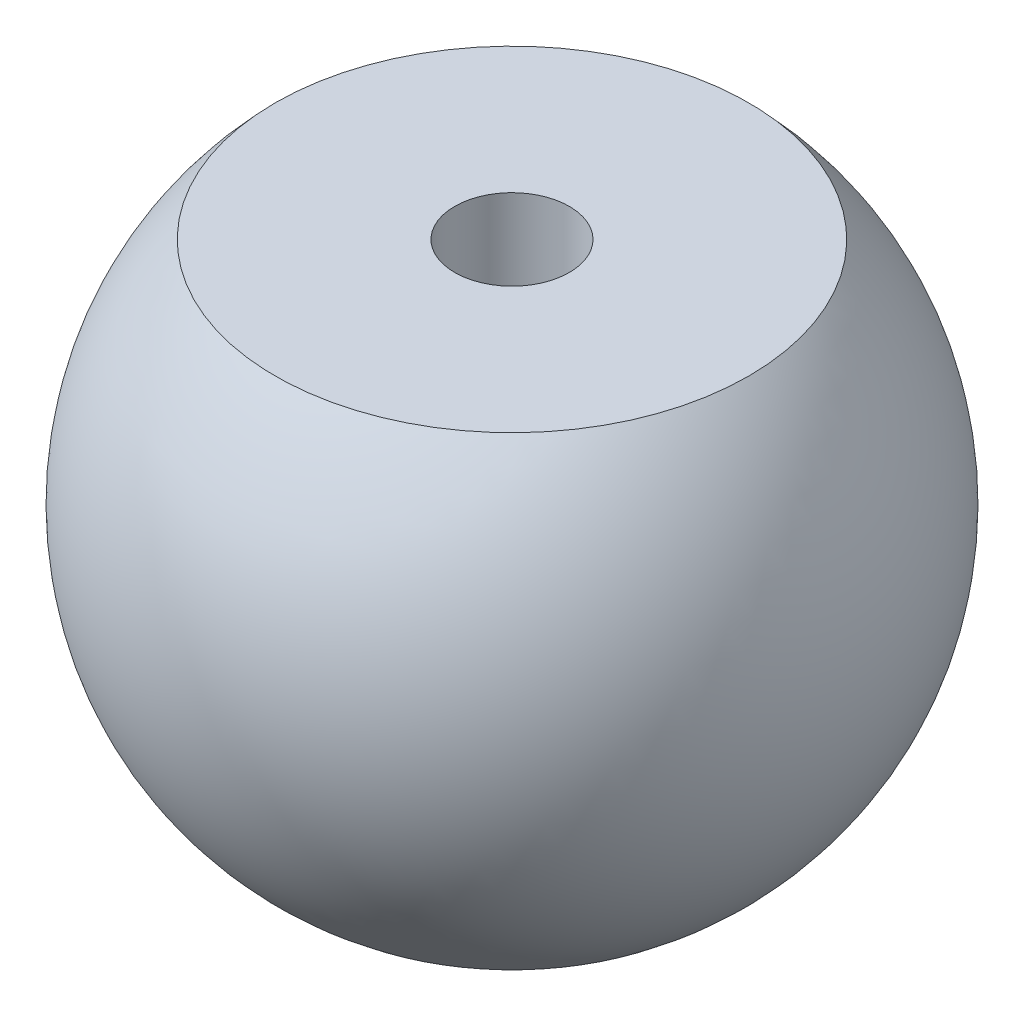
ISO-10303-21;
HEADER;
FILE_DESCRIPTION(('STEP AP214'),'2;1');
FILE_NAME('part.step','',(''),(''),'','','');
FILE_SCHEMA(('AUTOMOTIVE_DESIGN { 1 0 10303 214 1 1 1 1 }'));
ENDSEC;
DATA;
#1=APPLICATION_CONTEXT('core data for automotive mechanical design processes');
#2=APPLICATION_PROTOCOL_DEFINITION('international standard','automotive_design',2000,#1);
#3=PRODUCT_CONTEXT('',#1,'mechanical');
#4=PRODUCT('Part','Part','',(#3));
#5=PRODUCT_RELATED_PRODUCT_CATEGORY('part','',(#4));
#6=PRODUCT_DEFINITION_FORMATION('','',#4);
#7=PRODUCT_DEFINITION_CONTEXT('part definition',#1,'design');
#8=PRODUCT_DEFINITION('design','',#6,#7);
#9=PRODUCT_DEFINITION_SHAPE('','',#8);
#10=(LENGTH_UNIT() NAMED_UNIT(*) SI_UNIT(.MILLI.,.METRE.));
#11=(NAMED_UNIT(*) PLANE_ANGLE_UNIT() SI_UNIT($,.RADIAN.));
#12=(NAMED_UNIT(*) SI_UNIT($,.STERADIAN.) SOLID_ANGLE_UNIT());
#13=UNCERTAINTY_MEASURE_WITH_UNIT(LENGTH_MEASURE(1.E-05),#10,'distance_accuracy_value','');
#14=(GEOMETRIC_REPRESENTATION_CONTEXT(3) GLOBAL_UNCERTAINTY_ASSIGNED_CONTEXT((#13)) GLOBAL_UNIT_ASSIGNED_CONTEXT((#10,
#11,#12)) REPRESENTATION_CONTEXT('',''));
#15=CARTESIAN_POINT('',(0.,0.,0.));
#16=DIRECTION('',(0.,0.,1.));
#17=DIRECTION('',(1.,0.,0.));
#18=AXIS2_PLACEMENT_3D('',#15,#16,#17);
#19=CARTESIAN_POINT('',(0.,-11.,0.));
#20=DIRECTION('',(0.,1.,0.));
#21=DIRECTION('',(-1.,0.,0.));
#22=AXIS2_PLACEMENT_3D('',#19,#20,#21);
#23=PLANE('',#22);
#24=CARTESIAN_POINT('',(0.,-11.,0.));
#25=DIRECTION('',(0.,1.,0.));
#26=DIRECTION('',(-1.,0.,0.));
#27=AXIS2_PLACEMENT_3D('',#24,#25,#26);
#28=CIRCLE('',#27,3.35410196624968);
#29=CARTESIAN_POINT('',(3.35410196624969,-11.,0.));
#30=VERTEX_POINT('',#29);
#31=EDGE_CURVE('E10',#30,#30,#28,.T.);
#32=ORIENTED_EDGE('',*,*,#31,.F.);
#33=EDGE_LOOP('',(#32));
#34=FACE_BOUND('',#33,.T.);
#35=CARTESIAN_POINT('',(0.,-11.,0.));
#36=DIRECTION('',(0.,1.,0.));
#37=DIRECTION('',(-1.,0.,0.));
#38=AXIS2_PLACEMENT_3D('',#35,#36,#37);
#39=CIRCLE('',#38,2.);
#40=CARTESIAN_POINT('',(-1.99999999999999,-11.,0.));
#41=VERTEX_POINT('',#40);
#42=EDGE_CURVE('E48',#41,#41,#39,.T.);
#43=ORIENTED_EDGE('',*,*,#42,.T.);
#44=EDGE_LOOP('',(#43));
#45=FACE_BOUND('',#44,.T.);
#46=ADVANCED_FACE('F34',(#34,#45),#23,.F.);
#47=CARTESIAN_POINT('',(0.,0.,0.));
#48=DIRECTION('',(0.,1.,0.));
#49=DIRECTION('',(1.,0.,0.));
#50=AXIS2_PLACEMENT_3D('',#47,#48,#49);
#51=SPHERICAL_SURFACE('',#50,11.5);
#52=CARTESIAN_POINT('',(0.,8.,0.));
#53=DIRECTION('',(0.,1.,0.));
#54=DIRECTION('',(-1.,0.,0.));
#55=AXIS2_PLACEMENT_3D('',#52,#53,#54);
#56=CIRCLE('',#55,8.26135582092915);
#57=CARTESIAN_POINT('',(8.26135582092915,8.,0.));
#58=VERTEX_POINT('',#57);
#59=EDGE_CURVE('E40',#58,#58,#56,.T.);
#60=CARTESIAN_POINT('',(8.26135582092915,8.,0.));
#61=CARTESIAN_POINT('',(8.43171126013985,7.82409557992266,0.));
#62=CARTESIAN_POINT('',(8.59643104761927,7.64273556138185,0.));
#63=CARTESIAN_POINT('',(8.91396568343296,7.2698767624585,0.));
#64=CARTESIAN_POINT('',(9.06678053176724,7.07837798207596,0.));
#65=CARTESIAN_POINT('',(9.35987165360807,6.68601409455434,0.));
#66=CARTESIAN_POINT('',(9.50014792711463,6.48514898741527,0.));
#67=CARTESIAN_POINT('',(9.76759242438867,6.07487417128358,0.));
#68=CARTESIAN_POINT('',(9.89476064815616,5.86546446229097,0.));
#69=CARTESIAN_POINT('',(10.1354695556143,5.4389540536682,0.));
#70=CARTESIAN_POINT('',(10.249010239305,5.22185335403806,0.));
#71=CARTESIAN_POINT('',(10.4620011009446,4.78084674463797,0.));
#72=CARTESIAN_POINT('',(10.5614512788935,4.55694083486803,0.));
#73=CARTESIAN_POINT('',(10.7458553920272,4.1032371327801,0.));
#74=CARTESIAN_POINT('',(10.830809327212,3.87343934046211,0.));
#75=CARTESIAN_POINT('',(10.9858744189592,3.40888929257461,0.));
#76=CARTESIAN_POINT('',(11.0559855755216,3.1741370370051,0.));
#77=CARTESIAN_POINT('',(11.1810791038929,2.70063567719732,0.));
#78=CARTESIAN_POINT('',(11.2360614757018,2.46188657295905,0.));
#79=CARTESIAN_POINT('',(11.3306731476478,1.98136543872255,0.));
#80=CARTESIAN_POINT('',(11.370302447785,1.73959340872432,0.));
#81=CARTESIAN_POINT('',(11.4340463175022,1.25401267610785,0.));
#82=CARTESIAN_POINT('',(11.4581608870824,1.01020397348962,0.));
#83=CARTESIAN_POINT('',(11.4907769259203,0.521544457204971,0.));
#84=CARTESIAN_POINT('',(11.499278395178,0.276693643538559,0.));
#85=CARTESIAN_POINT('',(11.5006335535634,-0.213051282297264,0.));
#86=CARTESIAN_POINT('',(11.4934872426911,-0.457945394466674,0.));
#87=CARTESIAN_POINT('',(11.4635759925529,-0.946777928115893,0.));
#88=CARTESIAN_POINT('',(11.440811053287,-1.1907163495957,0.));
#89=CARTESIAN_POINT('',(11.3797554106923,-1.67664241119906,0.));
#90=CARTESIAN_POINT('',(11.3414647073635,-1.91863005132262,0.));
#91=CARTESIAN_POINT('',(11.2495137347582,-2.39966741730906,0.));
#92=CARTESIAN_POINT('',(11.1958534654818,-2.63871714317194,0.));
#93=CARTESIAN_POINT('',(11.0733822557039,-3.11290353227828,0.));
#94=CARTESIAN_POINT('',(11.0045713152026,-3.34804019552173,0.));
#95=CARTESIAN_POINT('',(10.8520794613757,-3.81344127346918,0.));
#96=CARTESIAN_POINT('',(10.7683985480501,-4.04370568817318,0.));
#97=CARTESIAN_POINT('',(10.586508105608,-4.4984229583381,0.));
#98=CARTESIAN_POINT('',(10.4882985764916,-4.72287581379903,0.));
#99=CARTESIAN_POINT('',(10.2777515256475,-5.16505436169525,0.));
#100=CARTESIAN_POINT('',(10.1654140039199,-5.38278005413055,0.));
#101=CARTESIAN_POINT('',(9.92706922292571,-5.81061611409863,0.));
#102=CARTESIAN_POINT('',(9.8010619636591,-6.02072648163142,0.));
#103=CARTESIAN_POINT('',(9.5358917252198,-6.43247479491401,0.));
#104=CARTESIAN_POINT('',(9.3967287460471,-6.63411274066381,0.));
#105=CARTESIAN_POINT('',(9.1058147511183,-7.0280936746815,0.));
#106=CARTESIAN_POINT('',(8.9540637353622,-7.22043666294938,0.));
#107=CARTESIAN_POINT('',(8.63859270074835,-7.59504306336991,0.));
#108=CARTESIAN_POINT('',(8.47487268189061,-7.77730647552257,0.));
#109=CARTESIAN_POINT('',(8.13613149875285,-8.13101022080472,0.));
#110=CARTESIAN_POINT('',(7.96111033447283,-8.30245055393421,0.));
#111=CARTESIAN_POINT('',(7.60048082082004,-8.63380879444348,0.));
#112=CARTESIAN_POINT('',(7.41487247144728,-8.79372670182325,0.));
#113=CARTESIAN_POINT('',(7.03382572761138,-9.1013877250956,0.));
#114=CARTESIAN_POINT('',(6.83838733314824,-9.24913084098818,0.));
#115=CARTESIAN_POINT('',(6.43847776956574,-9.53183966227217,0.));
#116=CARTESIAN_POINT('',(6.23400660044637,-9.66680536766359,0.));
#117=CARTESIAN_POINT('',(5.81686548932696,-9.92340856368289,0.));
#118=CARTESIAN_POINT('',(5.60419554732691,-10.0450460543108,0.));
#119=CARTESIAN_POINT('',(5.17152476934351,-10.2744975344831,0.));
#120=CARTESIAN_POINT('',(4.95152393336014,-10.3823115240276,0.));
#121=CARTESIAN_POINT('',(4.50508753833102,-10.5836728190334,0.));
#122=CARTESIAN_POINT('',(4.27865197928525,-10.6772201244946,0.));
#123=CARTESIAN_POINT('',(3.8202745765978,-10.8496790633218,0.));
#124=CARTESIAN_POINT('',(3.58833273295611,-10.9285906966878,0.));
#125=CARTESIAN_POINT('',(3.35410196624969,-11.,0.));
#126=B_SPLINE_CURVE_WITH_KNOTS('',3,(#60,#61,#62,#63,#64,#65,#66,#67,#68,#69,#70,#71,#72,#73,
#74,#75,#76,#77,#78,#79,#80,#81,#82,#83,#84,#85,#86,#87,#88,#89,#90,#91,#92,#93,#94,#95,#96,#97,
#98,#99,#100,#101,#102,#103,#104,#105,#106,#107,#108,#109,#110,#111,#112,#113,#114,#115,#116,
#117,#118,#119,#120,#121,#122,#123,#124,#125),.UNSPECIFIED.,.F.,.F.,(4,2,2,2,2,2,2,2,2,2,2,2,2,
2,2,2,2,2,2,2,2,2,2,2,2,2,2,2,2,2,2,2,4),(0.,0.734495369910508,1.46899073982102,
2.20348610973153,2.93798147964203,3.67247684955254,4.40697221946305,5.14146758937356,
5.87596295928407,6.61045832919457,7.34495369910508,8.07944906901559,8.8139444389261,
9.54843980883661,10.2829351787471,11.0174305486576,11.7519259185681,12.4864212884786,
13.2209166583892,13.9554120282997,14.6899073982102,15.4244027681207,16.1588981380312,
16.8933935079417,17.6278888778522,18.3623842477627,19.0968796176732,19.8313749875837,
20.5658703574942,21.3003657274047,22.0348610973153,22.7693564672258,23.5038518371363),.UNSPECIFIED.);
#127=EDGE_CURVE('BSEAM63',#58,#30,#126,.T.);
#128=ORIENTED_EDGE('',*,*,#59,.F.);
#129=ORIENTED_EDGE('',*,*,#31,.T.);
#130=ORIENTED_EDGE('',*,*,#127,.T.);
#131=ORIENTED_EDGE('',*,*,#127,.F.);
#132=EDGE_LOOP('',(#128,#130,#129,#131));
#133=FACE_BOUND('',#132,.T.);
#134=ADVANCED_FACE('F63',(#133),#51,.T.);
#135=CARTESIAN_POINT('',(0.,8.,0.));
#136=DIRECTION('',(0.,1.,0.));
#137=DIRECTION('',(-1.,0.,0.));
#138=AXIS2_PLACEMENT_3D('',#135,#136,#137);
#139=PLANE('',#138);
#140=ORIENTED_EDGE('',*,*,#59,.T.);
#141=EDGE_LOOP('',(#140));
#142=FACE_BOUND('',#141,.T.);
#143=CARTESIAN_POINT('',(0.,8.,0.));
#144=DIRECTION('',(0.,1.,0.));
#145=DIRECTION('',(-1.,0.,0.));
#146=AXIS2_PLACEMENT_3D('',#143,#144,#145);
#147=CIRCLE('',#146,2.);
#148=CARTESIAN_POINT('',(-2.,8.,0.));
#149=VERTEX_POINT('',#148);
#150=EDGE_CURVE('E44',#149,#149,#147,.T.);
#151=ORIENTED_EDGE('',*,*,#150,.F.);
#152=EDGE_LOOP('',(#151));
#153=FACE_BOUND('',#152,.T.);
#154=ADVANCED_FACE('F58',(#142,#153),#139,.T.);
#155=CARTESIAN_POINT('',(0.,18.2815052749455,0.));
#156=DIRECTION('',(0.,1.,0.));
#157=DIRECTION('',(-1.,0.,0.));
#158=AXIS2_PLACEMENT_3D('',#155,#156,#157);
#159=CYLINDRICAL_SURFACE('',#158,2.);
#160=ORIENTED_EDGE('',*,*,#42,.F.);
#161=EDGE_LOOP('',(#160));
#162=FACE_BOUND('',#161,.T.);
#163=ORIENTED_EDGE('',*,*,#150,.T.);
#164=EDGE_LOOP('',(#163));
#165=FACE_BOUND('',#164,.T.);
#166=ADVANCED_FACE('F55',(#162,#165),#159,.F.);
#167=CLOSED_SHELL('',(#46,#134,#154,#166));
#168=MANIFOLD_SOLID_BREP('B2',#167);
#169=ADVANCED_BREP_SHAPE_REPRESENTATION('',(#18,#168),#14);
#170=SHAPE_DEFINITION_REPRESENTATION(#9,#169);
ENDSEC;
END-ISO-10303-21;
